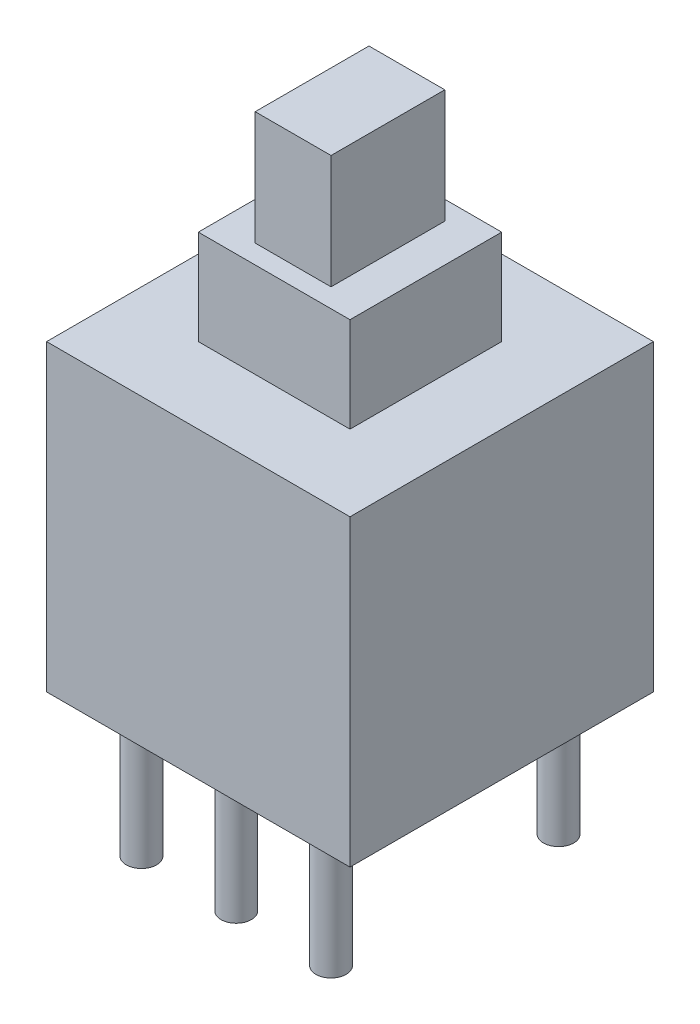
ISO-10303-21;
HEADER;
FILE_DESCRIPTION(('STEP AP214'),'2;1');
FILE_NAME('part.step','',(''),(''),'','','');
FILE_SCHEMA(('AUTOMOTIVE_DESIGN { 1 0 10303 214 1 1 1 1 }'));
ENDSEC;
DATA;
#1=APPLICATION_CONTEXT('core data for automotive mechanical design processes');
#2=APPLICATION_PROTOCOL_DEFINITION('international standard','automotive_design',2000,#1);
#3=PRODUCT_CONTEXT('',#1,'mechanical');
#4=PRODUCT('Part','Part','',(#3));
#5=PRODUCT_RELATED_PRODUCT_CATEGORY('part','',(#4));
#6=PRODUCT_DEFINITION_FORMATION('','',#4);
#7=PRODUCT_DEFINITION_CONTEXT('part definition',#1,'design');
#8=PRODUCT_DEFINITION('design','',#6,#7);
#9=PRODUCT_DEFINITION_SHAPE('','',#8);
#10=(LENGTH_UNIT() NAMED_UNIT(*) SI_UNIT(.MILLI.,.METRE.));
#11=(NAMED_UNIT(*) PLANE_ANGLE_UNIT() SI_UNIT($,.RADIAN.));
#12=(NAMED_UNIT(*) SI_UNIT($,.STERADIAN.) SOLID_ANGLE_UNIT());
#13=UNCERTAINTY_MEASURE_WITH_UNIT(LENGTH_MEASURE(1.E-05),#10,'distance_accuracy_value','');
#14=(GEOMETRIC_REPRESENTATION_CONTEXT(3) GLOBAL_UNCERTAINTY_ASSIGNED_CONTEXT((#13)) GLOBAL_UNIT_ASSIGNED_CONTEXT((#10,
#11,#12)) REPRESENTATION_CONTEXT('',''));
#15=CARTESIAN_POINT('',(0.,0.,0.));
#16=DIRECTION('',(0.,0.,1.));
#17=DIRECTION('',(1.,0.,0.));
#18=AXIS2_PLACEMENT_3D('',#15,#16,#17);
#19=CARTESIAN_POINT('',(2.,13.5,2.));
#20=DIRECTION('',(-1.,0.,0.));
#21=DIRECTION('',(0.,0.,1.));
#22=AXIS2_PLACEMENT_3D('',#19,#20,#21);
#23=PLANE('',#22);
#24=DIRECTION('',(0.,0.,-1.));
#25=VECTOR('',#24,1.);
#26=CARTESIAN_POINT('',(2.,10.5,2.));
#27=LINE('',#26,#25);
#28=CARTESIAN_POINT('',(2.,10.5,2.));
#29=VERTEX_POINT('',#28);
#30=CARTESIAN_POINT('',(2.,10.5,-2.));
#31=VERTEX_POINT('',#30);
#32=EDGE_CURVE('E150',#29,#31,#27,.T.);
#33=ORIENTED_EDGE('',*,*,#32,.F.);
#34=DIRECTION('',(0.,-1.,0.));
#35=VECTOR('',#34,1.);
#36=CARTESIAN_POINT('',(2.,13.5,2.));
#37=LINE('',#36,#35);
#38=CARTESIAN_POINT('',(2.,8.,2.));
#39=VERTEX_POINT('',#38);
#40=EDGE_CURVE('E191',#29,#39,#37,.T.);
#41=ORIENTED_EDGE('',*,*,#40,.T.);
#42=DIRECTION('',(0.,0.,-1.));
#43=VECTOR('',#42,1.);
#44=CARTESIAN_POINT('',(2.,8.,2.));
#45=LINE('',#44,#43);
#46=CARTESIAN_POINT('',(2.,8.,-2.));
#47=VERTEX_POINT('',#46);
#48=EDGE_CURVE('E179',#39,#47,#45,.T.);
#49=ORIENTED_EDGE('',*,*,#48,.T.);
#50=DIRECTION('',(0.,-1.,0.));
#51=VECTOR('',#50,1.);
#52=CARTESIAN_POINT('',(2.,13.5,-2.));
#53=LINE('',#52,#51);
#54=EDGE_CURVE('E197',#31,#47,#53,.T.);
#55=ORIENTED_EDGE('',*,*,#54,.F.);
#56=EDGE_LOOP('',(#33,#41,#49,#55));
#57=FACE_BOUND('',#56,.T.);
#58=ADVANCED_FACE('F35',(#57),#23,.F.);
#59=CARTESIAN_POINT('',(-2.,13.5,2.));
#60=DIRECTION('',(1.,0.,0.));
#61=DIRECTION('',(0.,0.,-1.));
#62=AXIS2_PLACEMENT_3D('',#59,#60,#61);
#63=PLANE('',#62);
#64=DIRECTION('',(0.,0.,1.));
#65=VECTOR('',#64,1.);
#66=CARTESIAN_POINT('',(-2.,10.5,-2.));
#67=LINE('',#66,#65);
#68=CARTESIAN_POINT('',(-2.,10.5,-2.));
#69=VERTEX_POINT('',#68);
#70=CARTESIAN_POINT('',(-2.,10.5,2.));
#71=VERTEX_POINT('',#70);
#72=EDGE_CURVE('E145',#69,#71,#67,.T.);
#73=ORIENTED_EDGE('',*,*,#72,.F.);
#74=DIRECTION('',(0.,-1.,0.));
#75=VECTOR('',#74,1.);
#76=CARTESIAN_POINT('',(-2.,13.5,-2.));
#77=LINE('',#76,#75);
#78=CARTESIAN_POINT('',(-2.,8.,-2.));
#79=VERTEX_POINT('',#78);
#80=EDGE_CURVE('E195',#69,#79,#77,.T.);
#81=ORIENTED_EDGE('',*,*,#80,.T.);
#82=DIRECTION('',(0.,0.,1.));
#83=VECTOR('',#82,1.);
#84=CARTESIAN_POINT('',(-2.,8.,2.));
#85=LINE('',#84,#83);
#86=CARTESIAN_POINT('',(-2.,8.,2.));
#87=VERTEX_POINT('',#86);
#88=EDGE_CURVE('E185',#79,#87,#85,.T.);
#89=ORIENTED_EDGE('',*,*,#88,.T.);
#90=DIRECTION('',(0.,-1.,0.));
#91=VECTOR('',#90,1.);
#92=CARTESIAN_POINT('',(-2.,13.5,2.));
#93=LINE('',#92,#91);
#94=EDGE_CURVE('E193',#71,#87,#93,.T.);
#95=ORIENTED_EDGE('',*,*,#94,.F.);
#96=EDGE_LOOP('',(#73,#81,#89,#95));
#97=FACE_BOUND('',#96,.T.);
#98=ADVANCED_FACE('F288',(#97),#63,.F.);
#99=CARTESIAN_POINT('',(-4.,8.,-4.));
#100=DIRECTION('',(1.,0.,0.));
#101=DIRECTION('',(0.,0.,-1.));
#102=AXIS2_PLACEMENT_3D('',#99,#100,#101);
#103=PLANE('',#102);
#104=DIRECTION('',(0.,0.,1.));
#105=VECTOR('',#104,1.);
#106=CARTESIAN_POINT('',(-4.,0.,-4.));
#107=LINE('',#106,#105);
#108=CARTESIAN_POINT('',(-4.,0.,-4.));
#109=VERTEX_POINT('',#108);
#110=CARTESIAN_POINT('',(-4.,0.,4.));
#111=VERTEX_POINT('',#110);
#112=EDGE_CURVE('E199',#109,#111,#107,.T.);
#113=ORIENTED_EDGE('',*,*,#112,.T.);
#114=DIRECTION('',(0.,-1.,0.));
#115=VECTOR('',#114,1.);
#116=CARTESIAN_POINT('',(-4.,8.,4.));
#117=LINE('',#116,#115);
#118=CARTESIAN_POINT('',(-4.,8.,4.));
#119=VERTEX_POINT('',#118);
#120=EDGE_CURVE('E226',#119,#111,#117,.T.);
#121=ORIENTED_EDGE('',*,*,#120,.F.);
#122=DIRECTION('',(0.,0.,1.));
#123=VECTOR('',#122,1.);
#124=CARTESIAN_POINT('',(-4.,8.,-4.));
#125=LINE('',#124,#123);
#126=CARTESIAN_POINT('',(-4.,8.,-4.));
#127=VERTEX_POINT('',#126);
#128=EDGE_CURVE('E200',#127,#119,#125,.T.);
#129=ORIENTED_EDGE('',*,*,#128,.F.);
#130=DIRECTION('',(0.,-1.,0.));
#131=VECTOR('',#130,1.);
#132=CARTESIAN_POINT('',(-4.,8.,-4.));
#133=LINE('',#132,#131);
#134=EDGE_CURVE('E210',#127,#109,#133,.T.);
#135=ORIENTED_EDGE('',*,*,#134,.T.);
#136=EDGE_LOOP('',(#113,#121,#129,#135));
#137=FACE_BOUND('',#136,.T.);
#138=ADVANCED_FACE('F37',(#137),#103,.F.);
#139=CARTESIAN_POINT('',(-4.,8.,4.));
#140=DIRECTION('',(0.,0.,-1.));
#141=DIRECTION('',(-1.,0.,0.));
#142=AXIS2_PLACEMENT_3D('',#139,#140,#141);
#143=PLANE('',#142);
#144=DIRECTION('',(1.,0.,0.));
#145=VECTOR('',#144,1.);
#146=CARTESIAN_POINT('',(-4.,0.,4.));
#147=LINE('',#146,#145);
#148=CARTESIAN_POINT('',(4.,0.,4.));
#149=VERTEX_POINT('',#148);
#150=EDGE_CURVE('E213',#111,#149,#147,.T.);
#151=ORIENTED_EDGE('',*,*,#150,.T.);
#152=DIRECTION('',(0.,-1.,0.));
#153=VECTOR('',#152,1.);
#154=CARTESIAN_POINT('',(4.,8.,4.));
#155=LINE('',#154,#153);
#156=CARTESIAN_POINT('',(4.,8.,4.));
#157=VERTEX_POINT('',#156);
#158=EDGE_CURVE('E223',#157,#149,#155,.T.);
#159=ORIENTED_EDGE('',*,*,#158,.F.);
#160=DIRECTION('',(1.,0.,0.));
#161=VECTOR('',#160,1.);
#162=CARTESIAN_POINT('',(-4.,8.,4.));
#163=LINE('',#162,#161);
#164=EDGE_CURVE('E203',#119,#157,#163,.T.);
#165=ORIENTED_EDGE('',*,*,#164,.F.);
#166=ORIENTED_EDGE('',*,*,#120,.T.);
#167=EDGE_LOOP('',(#151,#159,#165,#166));
#168=FACE_BOUND('',#167,.T.);
#169=ADVANCED_FACE('F276',(#168),#143,.F.);
#170=CARTESIAN_POINT('',(4.,8.,-4.));
#171=DIRECTION('',(-1.,0.,0.));
#172=DIRECTION('',(0.,0.,1.));
#173=AXIS2_PLACEMENT_3D('',#170,#171,#172);
#174=PLANE('',#173);
#175=DIRECTION('',(0.,0.,-1.));
#176=VECTOR('',#175,1.);
#177=CARTESIAN_POINT('',(4.,0.,-4.));
#178=LINE('',#177,#176);
#179=CARTESIAN_POINT('',(4.,0.,-4.));
#180=VERTEX_POINT('',#179);
#181=EDGE_CURVE('E215',#149,#180,#178,.T.);
#182=ORIENTED_EDGE('',*,*,#181,.T.);
#183=DIRECTION('',(0.,-1.,0.));
#184=VECTOR('',#183,1.);
#185=CARTESIAN_POINT('',(4.,8.,-4.));
#186=LINE('',#185,#184);
#187=CARTESIAN_POINT('',(4.,8.,-4.));
#188=VERTEX_POINT('',#187);
#189=EDGE_CURVE('E220',#188,#180,#186,.T.);
#190=ORIENTED_EDGE('',*,*,#189,.F.);
#191=DIRECTION('',(0.,0.,-1.));
#192=VECTOR('',#191,1.);
#193=CARTESIAN_POINT('',(4.,8.,-4.));
#194=LINE('',#193,#192);
#195=EDGE_CURVE('E206',#157,#188,#194,.T.);
#196=ORIENTED_EDGE('',*,*,#195,.F.);
#197=ORIENTED_EDGE('',*,*,#158,.T.);
#198=EDGE_LOOP('',(#182,#190,#196,#197));
#199=FACE_BOUND('',#198,.T.);
#200=ADVANCED_FACE('F273',(#199),#174,.F.);
#201=CARTESIAN_POINT('',(-4.,8.,-4.));
#202=DIRECTION('',(0.,0.,1.));
#203=DIRECTION('',(1.,0.,0.));
#204=AXIS2_PLACEMENT_3D('',#201,#202,#203);
#205=PLANE('',#204);
#206=DIRECTION('',(-1.,0.,0.));
#207=VECTOR('',#206,1.);
#208=CARTESIAN_POINT('',(-4.,0.,-4.));
#209=LINE('',#208,#207);
#210=EDGE_CURVE('E204',#180,#109,#209,.T.);
#211=ORIENTED_EDGE('',*,*,#210,.T.);
#212=ORIENTED_EDGE('',*,*,#134,.F.);
#213=DIRECTION('',(-1.,0.,0.));
#214=VECTOR('',#213,1.);
#215=CARTESIAN_POINT('',(-4.,8.,-4.));
#216=LINE('',#215,#214);
#217=EDGE_CURVE('E208',#188,#127,#216,.T.);
#218=ORIENTED_EDGE('',*,*,#217,.F.);
#219=ORIENTED_EDGE('',*,*,#189,.T.);
#220=EDGE_LOOP('',(#211,#212,#218,#219));
#221=FACE_BOUND('',#220,.T.);
#222=ADVANCED_FACE('F269',(#221),#205,.F.);
#223=CARTESIAN_POINT('',(0.,8.,0.));
#224=DIRECTION('',(0.,1.,0.));
#225=DIRECTION('',(0.,0.,1.));
#226=AXIS2_PLACEMENT_3D('',#223,#224,#225);
#227=PLANE('',#226);
#228=ORIENTED_EDGE('',*,*,#48,.F.);
#229=DIRECTION('',(1.,0.,0.));
#230=VECTOR('',#229,1.);
#231=CARTESIAN_POINT('',(-2.,8.,2.));
#232=LINE('',#231,#230);
#233=EDGE_CURVE('E188',#87,#39,#232,.T.);
#234=ORIENTED_EDGE('',*,*,#233,.F.);
#235=ORIENTED_EDGE('',*,*,#88,.F.);
#236=DIRECTION('',(-1.,0.,0.));
#237=VECTOR('',#236,1.);
#238=CARTESIAN_POINT('',(-2.,8.,-2.));
#239=LINE('',#238,#237);
#240=EDGE_CURVE('E182',#47,#79,#239,.T.);
#241=ORIENTED_EDGE('',*,*,#240,.F.);
#242=EDGE_LOOP('',(#228,#234,#235,#241));
#243=FACE_BOUND('',#242,.T.);
#244=ORIENTED_EDGE('',*,*,#128,.T.);
#245=ORIENTED_EDGE('',*,*,#164,.T.);
#246=ORIENTED_EDGE('',*,*,#195,.T.);
#247=ORIENTED_EDGE('',*,*,#217,.T.);
#248=EDGE_LOOP('',(#244,#245,#246,#247));
#249=FACE_BOUND('',#248,.T.);
#250=ADVANCED_FACE('F249',(#243,#249),#227,.T.);
#251=CARTESIAN_POINT('',(0.,0.,0.));
#252=DIRECTION('',(0.,1.,0.));
#253=DIRECTION('',(0.,0.,1.));
#254=AXIS2_PLACEMENT_3D('',#251,#252,#253);
#255=PLANE('',#254);
#256=CARTESIAN_POINT('',(0.,0.,-3.));
#257=DIRECTION('',(0.,1.,0.));
#258=DIRECTION('',(0.,0.,1.));
#259=AXIS2_PLACEMENT_3D('',#256,#257,#258);
#260=CIRCLE('',#259,0.4);
#261=CARTESIAN_POINT('',(0.,0.,-2.6));
#262=VERTEX_POINT('',#261);
#263=EDGE_CURVE('E11',#262,#262,#260,.F.);
#264=ORIENTED_EDGE('',*,*,#263,.F.);
#265=EDGE_LOOP('',(#264));
#266=FACE_BOUND('',#265,.T.);
#267=CARTESIAN_POINT('',(-2.5,0.,-3.));
#268=DIRECTION('',(0.,1.,0.));
#269=DIRECTION('',(0.,0.,1.));
#270=AXIS2_PLACEMENT_3D('',#267,#268,#269);
#271=CIRCLE('',#270,0.4);
#272=CARTESIAN_POINT('',(-2.5,0.,-2.6));
#273=VERTEX_POINT('',#272);
#274=EDGE_CURVE('E43',#273,#273,#271,.F.);
#275=ORIENTED_EDGE('',*,*,#274,.F.);
#276=EDGE_LOOP('',(#275));
#277=FACE_BOUND('',#276,.T.);
#278=CARTESIAN_POINT('',(2.5,0.,-3.));
#279=DIRECTION('',(0.,1.,0.));
#280=DIRECTION('',(0.,0.,1.));
#281=AXIS2_PLACEMENT_3D('',#278,#279,#280);
#282=CIRCLE('',#281,0.4);
#283=CARTESIAN_POINT('',(2.5,0.,-2.6));
#284=VERTEX_POINT('',#283);
#285=EDGE_CURVE('E238',#284,#284,#282,.F.);
#286=ORIENTED_EDGE('',*,*,#285,.F.);
#287=EDGE_LOOP('',(#286));
#288=FACE_BOUND('',#287,.T.);
#289=CARTESIAN_POINT('',(2.5,0.,3.));
#290=DIRECTION('',(0.,1.,0.));
#291=DIRECTION('',(0.,0.,1.));
#292=AXIS2_PLACEMENT_3D('',#289,#290,#291);
#293=CIRCLE('',#292,0.4);
#294=CARTESIAN_POINT('',(2.5,0.,3.4));
#295=VERTEX_POINT('',#294);
#296=EDGE_CURVE('E235',#295,#295,#293,.F.);
#297=ORIENTED_EDGE('',*,*,#296,.F.);
#298=EDGE_LOOP('',(#297));
#299=FACE_BOUND('',#298,.T.);
#300=CARTESIAN_POINT('',(-2.5,0.,3.));
#301=DIRECTION('',(0.,1.,0.));
#302=DIRECTION('',(0.,0.,1.));
#303=AXIS2_PLACEMENT_3D('',#300,#301,#302);
#304=CIRCLE('',#303,0.4);
#305=CARTESIAN_POINT('',(-2.5,0.,3.4));
#306=VERTEX_POINT('',#305);
#307=EDGE_CURVE('E232',#306,#306,#304,.F.);
#308=ORIENTED_EDGE('',*,*,#307,.F.);
#309=EDGE_LOOP('',(#308));
#310=FACE_BOUND('',#309,.T.);
#311=CARTESIAN_POINT('',(0.,0.,3.));
#312=DIRECTION('',(0.,1.,0.));
#313=DIRECTION('',(0.,0.,1.));
#314=AXIS2_PLACEMENT_3D('',#311,#312,#313);
#315=CIRCLE('',#314,0.4);
#316=CARTESIAN_POINT('',(0.,0.,3.4));
#317=VERTEX_POINT('',#316);
#318=EDGE_CURVE('E229',#317,#317,#315,.F.);
#319=ORIENTED_EDGE('',*,*,#318,.F.);
#320=EDGE_LOOP('',(#319));
#321=FACE_BOUND('',#320,.T.);
#322=ORIENTED_EDGE('',*,*,#112,.F.);
#323=ORIENTED_EDGE('',*,*,#210,.F.);
#324=ORIENTED_EDGE('',*,*,#181,.F.);
#325=ORIENTED_EDGE('',*,*,#150,.F.);
#326=EDGE_LOOP('',(#322,#323,#324,#325));
#327=FACE_BOUND('',#326,.T.);
#328=ADVANCED_FACE('F245',(#266,#277,#288,#299,#310,#321,#327),#255,.F.);
#329=CARTESIAN_POINT('',(-2.,13.5,-2.));
#330=DIRECTION('',(0.,0.,1.));
#331=DIRECTION('',(1.,0.,0.));
#332=AXIS2_PLACEMENT_3D('',#329,#330,#331);
#333=PLANE('',#332);
#334=DIRECTION('',(-1.,0.,0.));
#335=VECTOR('',#334,1.);
#336=CARTESIAN_POINT('',(-2.,10.5,-2.));
#337=LINE('',#336,#335);
#338=EDGE_CURVE('E154',#31,#69,#337,.T.);
#339=ORIENTED_EDGE('',*,*,#338,.F.);
#340=ORIENTED_EDGE('',*,*,#54,.T.);
#341=ORIENTED_EDGE('',*,*,#240,.T.);
#342=ORIENTED_EDGE('',*,*,#80,.F.);
#343=EDGE_LOOP('',(#339,#340,#341,#342));
#344=FACE_BOUND('',#343,.T.);
#345=ADVANCED_FACE('F248',(#344),#333,.F.);
#346=CARTESIAN_POINT('',(-2.,13.5,2.));
#347=DIRECTION('',(0.,0.,-1.));
#348=DIRECTION('',(-1.,0.,0.));
#349=AXIS2_PLACEMENT_3D('',#346,#347,#348);
#350=PLANE('',#349);
#351=ORIENTED_EDGE('',*,*,#40,.F.);
#352=DIRECTION('',(1.,0.,0.));
#353=VECTOR('',#352,1.);
#354=CARTESIAN_POINT('',(-2.,10.5,2.));
#355=LINE('',#354,#353);
#356=EDGE_CURVE('E148',#71,#29,#355,.T.);
#357=ORIENTED_EDGE('',*,*,#356,.F.);
#358=ORIENTED_EDGE('',*,*,#94,.T.);
#359=ORIENTED_EDGE('',*,*,#233,.T.);
#360=EDGE_LOOP('',(#351,#357,#358,#359));
#361=FACE_BOUND('',#360,.T.);
#362=ADVANCED_FACE('F299',(#361),#350,.F.);
#363=CARTESIAN_POINT('',(0.,13.5,0.));
#364=DIRECTION('',(0.,-1.,0.));
#365=DIRECTION('',(0.,0.,-1.));
#366=AXIS2_PLACEMENT_3D('',#363,#364,#365);
#367=PLANE('',#366);
#368=DIRECTION('',(0.,0.,1.));
#369=VECTOR('',#368,1.);
#370=CARTESIAN_POINT('',(1.,13.5,2.));
#371=LINE('',#370,#369);
#372=CARTESIAN_POINT('',(1.,13.5,-1.5));
#373=VERTEX_POINT('',#372);
#374=CARTESIAN_POINT('',(1.,13.5,1.5));
#375=VERTEX_POINT('',#374);
#376=EDGE_CURVE('E157',#373,#375,#371,.T.);
#377=ORIENTED_EDGE('',*,*,#376,.F.);
#378=DIRECTION('',(1.,0.,0.));
#379=VECTOR('',#378,1.);
#380=CARTESIAN_POINT('',(-4.,13.5,-1.5));
#381=LINE('',#380,#379);
#382=CARTESIAN_POINT('',(-1.,13.5,-1.5));
#383=VERTEX_POINT('',#382);
#384=EDGE_CURVE('E135',#383,#373,#381,.T.);
#385=ORIENTED_EDGE('',*,*,#384,.F.);
#386=DIRECTION('',(0.,0.,-1.));
#387=VECTOR('',#386,1.);
#388=CARTESIAN_POINT('',(-1.,13.5,-2.));
#389=LINE('',#388,#387);
#390=CARTESIAN_POINT('',(-1.,13.5,1.5));
#391=VERTEX_POINT('',#390);
#392=EDGE_CURVE('E140',#391,#383,#389,.T.);
#393=ORIENTED_EDGE('',*,*,#392,.F.);
#394=DIRECTION('',(1.,0.,0.));
#395=VECTOR('',#394,1.);
#396=CARTESIAN_POINT('',(-4.,13.5,1.5));
#397=LINE('',#396,#395);
#398=EDGE_CURVE('E124',#391,#375,#397,.T.);
#399=ORIENTED_EDGE('',*,*,#398,.T.);
#400=EDGE_LOOP('',(#377,#385,#393,#399));
#401=FACE_BOUND('',#400,.T.);
#402=ADVANCED_FACE('F144',(#401),#367,.F.);
#403=CARTESIAN_POINT('',(0.,-3.5,3.));
#404=DIRECTION('',(0.,1.,0.));
#405=DIRECTION('',(0.,0.,1.));
#406=AXIS2_PLACEMENT_3D('',#403,#404,#405);
#407=CYLINDRICAL_SURFACE('',#406,0.4);
#408=CARTESIAN_POINT('',(0.,-3.5,3.));
#409=DIRECTION('',(0.,-1.,0.));
#410=DIRECTION('',(0.,0.,-1.));
#411=AXIS2_PLACEMENT_3D('',#408,#409,#410);
#412=CIRCLE('',#411,0.4);
#413=CARTESIAN_POINT('',(0.,-3.5,2.6));
#414=VERTEX_POINT('',#413);
#415=EDGE_CURVE('E176',#414,#414,#412,.T.);
#416=ORIENTED_EDGE('',*,*,#415,.F.);
#417=EDGE_LOOP('',(#416));
#418=FACE_BOUND('',#417,.T.);
#419=ORIENTED_EDGE('',*,*,#318,.T.);
#420=EDGE_LOOP('',(#419));
#421=FACE_BOUND('',#420,.T.);
#422=ADVANCED_FACE('F307',(#418,#421),#407,.T.);
#423=CARTESIAN_POINT('',(0.,-3.5,3.));
#424=DIRECTION('',(0.,-1.,0.));
#425=DIRECTION('',(0.,0.,-1.));
#426=AXIS2_PLACEMENT_3D('',#423,#424,#425);
#427=PLANE('',#426);
#428=ORIENTED_EDGE('',*,*,#415,.T.);
#429=EDGE_LOOP('',(#428));
#430=FACE_BOUND('',#429,.T.);
#431=ADVANCED_FACE('F310',(#430),#427,.T.);
#432=CARTESIAN_POINT('',(-2.5,-3.5,3.));
#433=DIRECTION('',(0.,1.,0.));
#434=DIRECTION('',(0.,0.,1.));
#435=AXIS2_PLACEMENT_3D('',#432,#433,#434);
#436=CYLINDRICAL_SURFACE('',#435,0.4);
#437=CARTESIAN_POINT('',(-2.5,-3.5,3.));
#438=DIRECTION('',(0.,-1.,0.));
#439=DIRECTION('',(0.,0.,-1.));
#440=AXIS2_PLACEMENT_3D('',#437,#438,#439);
#441=CIRCLE('',#440,0.4);
#442=CARTESIAN_POINT('',(-2.5,-3.5,2.6));
#443=VERTEX_POINT('',#442);
#444=EDGE_CURVE('E173',#443,#443,#441,.T.);
#445=ORIENTED_EDGE('',*,*,#444,.F.);
#446=EDGE_LOOP('',(#445));
#447=FACE_BOUND('',#446,.T.);
#448=ORIENTED_EDGE('',*,*,#307,.T.);
#449=EDGE_LOOP('',(#448));
#450=FACE_BOUND('',#449,.T.);
#451=ADVANCED_FACE('F314',(#447,#450),#436,.T.);
#452=CARTESIAN_POINT('',(-2.5,-3.5,3.));
#453=DIRECTION('',(0.,-1.,0.));
#454=DIRECTION('',(0.,0.,-1.));
#455=AXIS2_PLACEMENT_3D('',#452,#453,#454);
#456=PLANE('',#455);
#457=ORIENTED_EDGE('',*,*,#444,.T.);
#458=EDGE_LOOP('',(#457));
#459=FACE_BOUND('',#458,.T.);
#460=ADVANCED_FACE('F318',(#459),#456,.T.);
#461=CARTESIAN_POINT('',(2.5,-3.5,3.));
#462=DIRECTION('',(0.,1.,0.));
#463=DIRECTION('',(0.,0.,1.));
#464=AXIS2_PLACEMENT_3D('',#461,#462,#463);
#465=CYLINDRICAL_SURFACE('',#464,0.4);
#466=CARTESIAN_POINT('',(2.5,-3.5,3.));
#467=DIRECTION('',(0.,-1.,0.));
#468=DIRECTION('',(0.,0.,-1.));
#469=AXIS2_PLACEMENT_3D('',#466,#467,#468);
#470=CIRCLE('',#469,0.4);
#471=CARTESIAN_POINT('',(2.5,-3.5,2.6));
#472=VERTEX_POINT('',#471);
#473=EDGE_CURVE('E170',#472,#472,#470,.T.);
#474=ORIENTED_EDGE('',*,*,#473,.F.);
#475=EDGE_LOOP('',(#474));
#476=FACE_BOUND('',#475,.T.);
#477=ORIENTED_EDGE('',*,*,#296,.T.);
#478=EDGE_LOOP('',(#477));
#479=FACE_BOUND('',#478,.T.);
#480=ADVANCED_FACE('F322',(#476,#479),#465,.T.);
#481=CARTESIAN_POINT('',(2.5,-3.5,3.));
#482=DIRECTION('',(0.,-1.,0.));
#483=DIRECTION('',(0.,0.,-1.));
#484=AXIS2_PLACEMENT_3D('',#481,#482,#483);
#485=PLANE('',#484);
#486=ORIENTED_EDGE('',*,*,#473,.T.);
#487=EDGE_LOOP('',(#486));
#488=FACE_BOUND('',#487,.T.);
#489=ADVANCED_FACE('F326',(#488),#485,.T.);
#490=CARTESIAN_POINT('',(2.5,-3.5,-3.));
#491=DIRECTION('',(0.,1.,0.));
#492=DIRECTION('',(0.,0.,1.));
#493=AXIS2_PLACEMENT_3D('',#490,#491,#492);
#494=CYLINDRICAL_SURFACE('',#493,0.4);
#495=CARTESIAN_POINT('',(2.5,-3.5,-3.));
#496=DIRECTION('',(0.,-1.,0.));
#497=DIRECTION('',(0.,0.,1.));
#498=AXIS2_PLACEMENT_3D('',#495,#496,#497);
#499=CIRCLE('',#498,0.4);
#500=CARTESIAN_POINT('',(2.5,-3.5,-2.6));
#501=VERTEX_POINT('',#500);
#502=EDGE_CURVE('E167',#501,#501,#499,.T.);
#503=ORIENTED_EDGE('',*,*,#502,.F.);
#504=EDGE_LOOP('',(#503));
#505=FACE_BOUND('',#504,.T.);
#506=ORIENTED_EDGE('',*,*,#285,.T.);
#507=EDGE_LOOP('',(#506));
#508=FACE_BOUND('',#507,.T.);
#509=ADVANCED_FACE('F330',(#505,#508),#494,.T.);
#510=CARTESIAN_POINT('',(2.5,-3.5,-3.));
#511=DIRECTION('',(0.,1.,0.));
#512=DIRECTION('',(0.,0.,1.));
#513=AXIS2_PLACEMENT_3D('',#510,#511,#512);
#514=PLANE('',#513);
#515=ORIENTED_EDGE('',*,*,#502,.T.);
#516=EDGE_LOOP('',(#515));
#517=FACE_BOUND('',#516,.T.);
#518=ADVANCED_FACE('F334',(#517),#514,.F.);
#519=CARTESIAN_POINT('',(-2.5,-3.5,-3.));
#520=DIRECTION('',(0.,1.,0.));
#521=DIRECTION('',(0.,0.,1.));
#522=AXIS2_PLACEMENT_3D('',#519,#520,#521);
#523=CYLINDRICAL_SURFACE('',#522,0.4);
#524=CARTESIAN_POINT('',(-2.5,-3.5,-3.));
#525=DIRECTION('',(0.,-1.,0.));
#526=DIRECTION('',(0.,0.,1.));
#527=AXIS2_PLACEMENT_3D('',#524,#525,#526);
#528=CIRCLE('',#527,0.4);
#529=CARTESIAN_POINT('',(-2.5,-3.5,-2.6));
#530=VERTEX_POINT('',#529);
#531=EDGE_CURVE('E164',#530,#530,#528,.T.);
#532=ORIENTED_EDGE('',*,*,#531,.F.);
#533=EDGE_LOOP('',(#532));
#534=FACE_BOUND('',#533,.T.);
#535=ORIENTED_EDGE('',*,*,#274,.T.);
#536=EDGE_LOOP('',(#535));
#537=FACE_BOUND('',#536,.T.);
#538=ADVANCED_FACE('F243',(#534,#537),#523,.T.);
#539=CARTESIAN_POINT('',(-2.5,-3.5,-3.));
#540=DIRECTION('',(0.,1.,0.));
#541=DIRECTION('',(0.,0.,1.));
#542=AXIS2_PLACEMENT_3D('',#539,#540,#541);
#543=PLANE('',#542);
#544=ORIENTED_EDGE('',*,*,#531,.T.);
#545=EDGE_LOOP('',(#544));
#546=FACE_BOUND('',#545,.T.);
#547=ADVANCED_FACE('F341',(#546),#543,.F.);
#548=CARTESIAN_POINT('',(0.,-3.5,-3.));
#549=DIRECTION('',(0.,1.,0.));
#550=DIRECTION('',(0.,0.,1.));
#551=AXIS2_PLACEMENT_3D('',#548,#549,#550);
#552=CYLINDRICAL_SURFACE('',#551,0.4);
#553=CARTESIAN_POINT('',(0.,-3.5,-3.));
#554=DIRECTION('',(0.,-1.,0.));
#555=DIRECTION('',(0.,0.,1.));
#556=AXIS2_PLACEMENT_3D('',#553,#554,#555);
#557=CIRCLE('',#556,0.4);
#558=CARTESIAN_POINT('',(0.,-3.5,-2.6));
#559=VERTEX_POINT('',#558);
#560=EDGE_CURVE('E161',#559,#559,#557,.T.);
#561=ORIENTED_EDGE('',*,*,#560,.F.);
#562=EDGE_LOOP('',(#561));
#563=FACE_BOUND('',#562,.T.);
#564=ORIENTED_EDGE('',*,*,#263,.T.);
#565=EDGE_LOOP('',(#564));
#566=FACE_BOUND('',#565,.T.);
#567=ADVANCED_FACE('F345',(#563,#566),#552,.T.);
#568=CARTESIAN_POINT('',(0.,-3.5,-3.));
#569=DIRECTION('',(0.,1.,0.));
#570=DIRECTION('',(0.,0.,1.));
#571=AXIS2_PLACEMENT_3D('',#568,#569,#570);
#572=PLANE('',#571);
#573=ORIENTED_EDGE('',*,*,#560,.T.);
#574=EDGE_LOOP('',(#573));
#575=FACE_BOUND('',#574,.T.);
#576=ADVANCED_FACE('F349',(#575),#572,.F.);
#577=CARTESIAN_POINT('',(1.,10.5,2.));
#578=DIRECTION('',(-1.,0.,0.));
#579=DIRECTION('',(0.,0.,1.));
#580=AXIS2_PLACEMENT_3D('',#577,#578,#579);
#581=PLANE('',#580);
#582=DIRECTION('',(0.,0.,1.));
#583=VECTOR('',#582,1.);
#584=CARTESIAN_POINT('',(1.,10.5,2.));
#585=LINE('',#584,#583);
#586=CARTESIAN_POINT('',(1.,10.5,-1.5));
#587=VERTEX_POINT('',#586);
#588=CARTESIAN_POINT('',(1.,10.5,1.5));
#589=VERTEX_POINT('',#588);
#590=EDGE_CURVE('E146',#587,#589,#585,.T.);
#591=ORIENTED_EDGE('',*,*,#590,.F.);
#592=DIRECTION('',(0.,1.,0.));
#593=VECTOR('',#592,1.);
#594=CARTESIAN_POINT('',(1.,10.5,-1.5));
#595=LINE('',#594,#593);
#596=EDGE_CURVE('E160',#587,#373,#595,.T.);
#597=ORIENTED_EDGE('',*,*,#596,.T.);
#598=ORIENTED_EDGE('',*,*,#376,.T.);
#599=DIRECTION('',(0.,-1.,0.));
#600=VECTOR('',#599,1.);
#601=CARTESIAN_POINT('',(1.,10.5,1.5));
#602=LINE('',#601,#600);
#603=EDGE_CURVE('E130',#375,#589,#602,.T.);
#604=ORIENTED_EDGE('',*,*,#603,.T.);
#605=EDGE_LOOP('',(#591,#597,#598,#604));
#606=FACE_BOUND('',#605,.T.);
#607=ADVANCED_FACE('F353',(#606),#581,.F.);
#608=CARTESIAN_POINT('',(-1.,10.5,-2.));
#609=DIRECTION('',(1.,0.,0.));
#610=DIRECTION('',(0.,0.,-1.));
#611=AXIS2_PLACEMENT_3D('',#608,#609,#610);
#612=PLANE('',#611);
#613=ORIENTED_EDGE('',*,*,#392,.T.);
#614=DIRECTION('',(0.,-1.,0.));
#615=VECTOR('',#614,1.);
#616=CARTESIAN_POINT('',(-1.,10.5,-1.5));
#617=LINE('',#616,#615);
#618=CARTESIAN_POINT('',(-1.,10.5,-1.5));
#619=VERTEX_POINT('',#618);
#620=EDGE_CURVE('E560',#383,#619,#617,.T.);
#621=ORIENTED_EDGE('',*,*,#620,.T.);
#622=DIRECTION('',(0.,0.,-1.));
#623=VECTOR('',#622,1.);
#624=CARTESIAN_POINT('',(-1.,10.5,-2.));
#625=LINE('',#624,#623);
#626=CARTESIAN_POINT('',(-1.,10.5,1.5));
#627=VERTEX_POINT('',#626);
#628=EDGE_CURVE('E141',#627,#619,#625,.T.);
#629=ORIENTED_EDGE('',*,*,#628,.F.);
#630=DIRECTION('',(0.,1.,0.));
#631=VECTOR('',#630,1.);
#632=CARTESIAN_POINT('',(-1.,10.5,1.5));
#633=LINE('',#632,#631);
#634=EDGE_CURVE('E127',#627,#391,#633,.T.);
#635=ORIENTED_EDGE('',*,*,#634,.T.);
#636=EDGE_LOOP('',(#613,#621,#629,#635));
#637=FACE_BOUND('',#636,.T.);
#638=ADVANCED_FACE('F139',(#637),#612,.F.);
#639=CARTESIAN_POINT('',(0.,10.5,0.));
#640=DIRECTION('',(0.,1.,0.));
#641=DIRECTION('',(0.,0.,1.));
#642=AXIS2_PLACEMENT_3D('',#639,#640,#641);
#643=PLANE('',#642);
#644=DIRECTION('',(1.,0.,0.));
#645=VECTOR('',#644,1.);
#646=CARTESIAN_POINT('',(-4.,10.5,-1.5));
#647=LINE('',#646,#645);
#648=EDGE_CURVE('E50',#619,#587,#647,.T.);
#649=ORIENTED_EDGE('',*,*,#648,.T.);
#650=ORIENTED_EDGE('',*,*,#590,.T.);
#651=DIRECTION('',(1.,0.,0.));
#652=VECTOR('',#651,1.);
#653=CARTESIAN_POINT('',(-4.,10.5,1.5));
#654=LINE('',#653,#652);
#655=EDGE_CURVE('E58',#627,#589,#654,.T.);
#656=ORIENTED_EDGE('',*,*,#655,.F.);
#657=ORIENTED_EDGE('',*,*,#628,.T.);
#658=EDGE_LOOP('',(#649,#650,#656,#657));
#659=FACE_BOUND('',#658,.T.);
#660=ORIENTED_EDGE('',*,*,#32,.T.);
#661=ORIENTED_EDGE('',*,*,#338,.T.);
#662=ORIENTED_EDGE('',*,*,#72,.T.);
#663=ORIENTED_EDGE('',*,*,#356,.T.);
#664=EDGE_LOOP('',(#660,#661,#662,#663));
#665=FACE_BOUND('',#664,.T.);
#666=ADVANCED_FACE('F360',(#659,#665),#643,.T.);
#667=CARTESIAN_POINT('',(-4.,13.5,1.5));
#668=DIRECTION('',(0.,0.,-1.));
#669=DIRECTION('',(0.,1.,0.));
#670=AXIS2_PLACEMENT_3D('',#667,#668,#669);
#671=PLANE('',#670);
#672=ORIENTED_EDGE('',*,*,#398,.F.);
#673=ORIENTED_EDGE('',*,*,#634,.F.);
#674=ORIENTED_EDGE('',*,*,#655,.T.);
#675=ORIENTED_EDGE('',*,*,#603,.F.);
#676=EDGE_LOOP('',(#672,#673,#674,#675));
#677=FACE_BOUND('',#676,.T.);
#678=ADVANCED_FACE('F126',(#677),#671,.F.);
#679=CARTESIAN_POINT('',(-4.,13.5,-1.5));
#680=DIRECTION('',(0.,0.,1.));
#681=DIRECTION('',(0.,-1.,0.));
#682=AXIS2_PLACEMENT_3D('',#679,#680,#681);
#683=PLANE('',#682);
#684=ORIENTED_EDGE('',*,*,#648,.F.);
#685=ORIENTED_EDGE('',*,*,#620,.F.);
#686=ORIENTED_EDGE('',*,*,#384,.T.);
#687=ORIENTED_EDGE('',*,*,#596,.F.);
#688=EDGE_LOOP('',(#684,#685,#686,#687));
#689=FACE_BOUND('',#688,.T.);
#690=ADVANCED_FACE('F365',(#689),#683,.F.);
#691=CLOSED_SHELL('',(#58,#98,#138,#169,#200,#222,#250,#328,#345,#362,#402,#422,#431,#451,#460,
#480,#489,#509,#518,#538,#547,#567,#576,#607,#638,#666,#678,#690));
#692=MANIFOLD_SOLID_BREP('B2',#691);
#693=ADVANCED_BREP_SHAPE_REPRESENTATION('',(#18,#692),#14);
#694=SHAPE_DEFINITION_REPRESENTATION(#9,#693);
ENDSEC;
END-ISO-10303-21;
